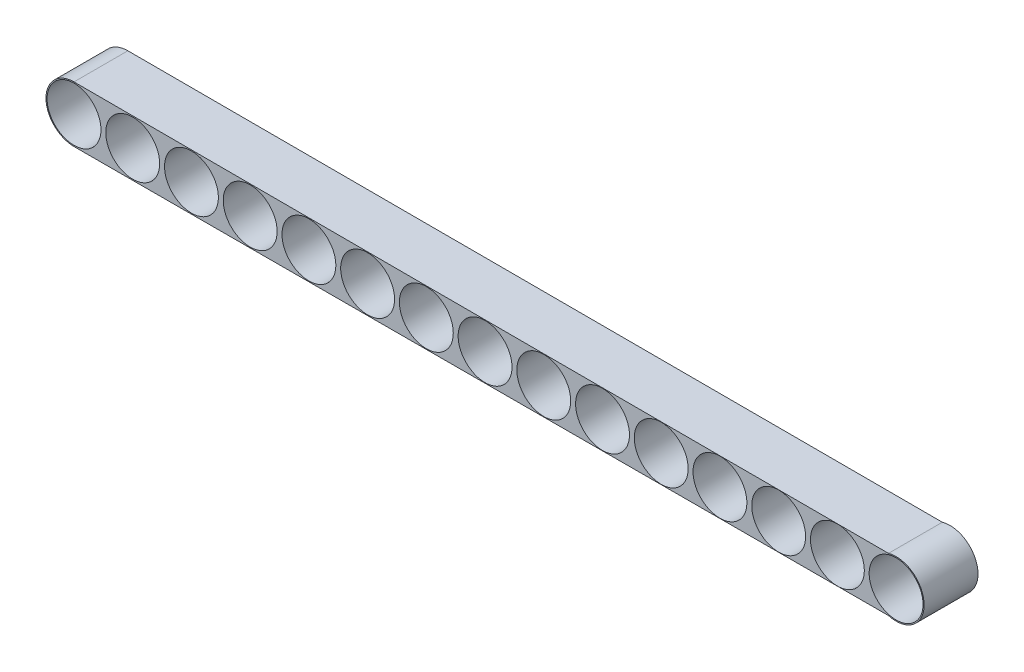
ISO-10303-21;
HEADER;
FILE_DESCRIPTION(('STEP AP214'),'2;1');
FILE_NAME('part.step','',(''),(''),'','','');
FILE_SCHEMA(('AUTOMOTIVE_DESIGN { 1 0 10303 214 1 1 1 1 }'));
ENDSEC;
DATA;
#1=APPLICATION_CONTEXT('core data for automotive mechanical design processes');
#2=APPLICATION_PROTOCOL_DEFINITION('international standard','automotive_design',2000,#1);
#3=PRODUCT_CONTEXT('',#1,'mechanical');
#4=PRODUCT('Part','Part','',(#3));
#5=PRODUCT_RELATED_PRODUCT_CATEGORY('part','',(#4));
#6=PRODUCT_DEFINITION_FORMATION('','',#4);
#7=PRODUCT_DEFINITION_CONTEXT('part definition',#1,'design');
#8=PRODUCT_DEFINITION('design','',#6,#7);
#9=PRODUCT_DEFINITION_SHAPE('','',#8);
#10=(LENGTH_UNIT() NAMED_UNIT(*) SI_UNIT(.MILLI.,.METRE.));
#11=(NAMED_UNIT(*) PLANE_ANGLE_UNIT() SI_UNIT($,.RADIAN.));
#12=(NAMED_UNIT(*) SI_UNIT($,.STERADIAN.) SOLID_ANGLE_UNIT());
#13=UNCERTAINTY_MEASURE_WITH_UNIT(LENGTH_MEASURE(1.E-05),#10,'distance_accuracy_value','');
#14=(GEOMETRIC_REPRESENTATION_CONTEXT(3) GLOBAL_UNCERTAINTY_ASSIGNED_CONTEXT((#13)) GLOBAL_UNIT_ASSIGNED_CONTEXT((#10,
#11,#12)) REPRESENTATION_CONTEXT('',''));
#15=CARTESIAN_POINT('',(0.,0.,0.));
#16=DIRECTION('',(0.,0.,1.));
#17=DIRECTION('',(1.,0.,0.));
#18=AXIS2_PLACEMENT_3D('',#15,#16,#17);
#19=CARTESIAN_POINT('',(0.000681519143892638,-0.519999106790113,1.));
#20=DIRECTION('',(-0.00131061486388455,0.999999141143971,0.));
#21=DIRECTION('',(-0.999999141143971,-0.00131061486388455,0.));
#22=AXIS2_PLACEMENT_3D('',#19,#20,#21);
#23=PLANE('',#22);
#24=DIRECTION('',(0.99999914114397,0.00131061486388455,0.));
#25=VECTOR('',#24,1.);
#26=CARTESIAN_POINT('',(0.000681519143892638,-0.519999106790113,0.));
#27=LINE('',#26,#25);
#28=CARTESIAN_POINT('',(0.,-0.52,0.));
#29=VERTEX_POINT('',#28);
#30=CARTESIAN_POINT('',(15.1178253576786,-0.500186336359531,0.));
#31=VERTEX_POINT('',#30);
#32=EDGE_CURVE('E144',#29,#31,#27,.T.);
#33=ORIENTED_EDGE('',*,*,#32,.T.);
#34=DIRECTION('',(0.,0.,-1.));
#35=VECTOR('',#34,1.);
#36=CARTESIAN_POINT('',(15.1178253576786,-0.500186336359531,1.));
#37=LINE('',#36,#35);
#38=CARTESIAN_POINT('',(15.1178253576786,-0.500186336359531,1.));
#39=VERTEX_POINT('',#38);
#40=EDGE_CURVE('E11',#39,#31,#37,.T.);
#41=ORIENTED_EDGE('',*,*,#40,.F.);
#42=DIRECTION('',(0.99999914114397,0.00131061486388455,0.));
#43=VECTOR('',#42,1.);
#44=CARTESIAN_POINT('',(0.000681519143892638,-0.519999106790113,1.));
#45=LINE('',#44,#43);
#46=CARTESIAN_POINT('',(0.,-0.52,1.));
#47=VERTEX_POINT('',#46);
#48=EDGE_CURVE('E84',#47,#39,#45,.T.);
#49=ORIENTED_EDGE('',*,*,#48,.F.);
#50=DIRECTION('',(0.,0.,-1.));
#51=VECTOR('',#50,1.);
#52=CARTESIAN_POINT('',(0.,-0.52,1.));
#53=LINE('',#52,#51);
#54=EDGE_CURVE('E140',#47,#29,#53,.T.);
#55=ORIENTED_EDGE('',*,*,#54,.T.);
#56=EDGE_LOOP('',(#33,#41,#49,#55));
#57=FACE_BOUND('',#56,.T.);
#58=ADVANCED_FACE('F35',(#57),#23,.F.);
#59=CARTESIAN_POINT('',(15.26,0.,1.));
#60=DIRECTION('',(0.,0.,-1.));
#61=DIRECTION('',(-1.,0.,0.));
#62=AXIS2_PLACEMENT_3D('',#59,#60,#61);
#63=CYLINDRICAL_SURFACE('',#62,0.520000000000001);
#64=CARTESIAN_POINT('',(15.26,0.,0.));
#65=DIRECTION('',(0.,0.,1.));
#66=DIRECTION('',(1.,0.,0.));
#67=AXIS2_PLACEMENT_3D('',#64,#65,#66);
#68=CIRCLE('',#67,0.520000000000001);
#69=CARTESIAN_POINT('',(15.1178253576786,0.500186336359531,0.));
#70=VERTEX_POINT('',#69);
#71=EDGE_CURVE('E89',#31,#70,#68,.T.);
#72=ORIENTED_EDGE('',*,*,#71,.T.);
#73=DIRECTION('',(0.,0.,-1.));
#74=VECTOR('',#73,1.);
#75=CARTESIAN_POINT('',(15.1178253576786,0.500186336359531,1.));
#76=LINE('',#75,#74);
#77=CARTESIAN_POINT('',(15.1178253576786,0.500186336359531,1.));
#78=VERTEX_POINT('',#77);
#79=EDGE_CURVE('E44',#78,#70,#76,.T.);
#80=ORIENTED_EDGE('',*,*,#79,.F.);
#81=CARTESIAN_POINT('',(15.26,0.,1.));
#82=DIRECTION('',(0.,0.,1.));
#83=DIRECTION('',(1.,0.,0.));
#84=AXIS2_PLACEMENT_3D('',#81,#82,#83);
#85=CIRCLE('',#84,0.520000000000001);
#86=EDGE_CURVE('E78',#39,#78,#85,.T.);
#87=ORIENTED_EDGE('',*,*,#86,.F.);
#88=ORIENTED_EDGE('',*,*,#40,.T.);
#89=EDGE_LOOP('',(#72,#80,#87,#88));
#90=FACE_BOUND('',#89,.T.);
#91=ADVANCED_FACE('F88',(#90),#63,.T.);
#92=CARTESIAN_POINT('',(0.000681519143892638,0.519999106790113,1.));
#93=DIRECTION('',(0.00131061486388455,0.999999141143971,0.));
#94=DIRECTION('',(-0.999999141143971,0.00131061486388455,0.));
#95=AXIS2_PLACEMENT_3D('',#92,#93,#94);
#96=PLANE('',#95);
#97=DIRECTION('',(0.99999914114397,-0.00131061486388455,0.));
#98=VECTOR('',#97,1.);
#99=CARTESIAN_POINT('',(0.000681519143892638,0.519999106790113,0.));
#100=LINE('',#99,#98);
#101=CARTESIAN_POINT('',(0.,0.52,0.));
#102=VERTEX_POINT('',#101);
#103=EDGE_CURVE('E148',#102,#70,#100,.T.);
#104=ORIENTED_EDGE('',*,*,#103,.F.);
#105=DIRECTION('',(0.,0.,-1.));
#106=VECTOR('',#105,1.);
#107=CARTESIAN_POINT('',(0.,0.52,1.));
#108=LINE('',#107,#106);
#109=CARTESIAN_POINT('',(0.,0.52,1.));
#110=VERTEX_POINT('',#109);
#111=EDGE_CURVE('E68',#110,#102,#108,.T.);
#112=ORIENTED_EDGE('',*,*,#111,.F.);
#113=DIRECTION('',(0.99999914114397,-0.00131061486388455,0.));
#114=VECTOR('',#113,1.);
#115=CARTESIAN_POINT('',(0.000681519143892638,0.519999106790113,1.));
#116=LINE('',#115,#114);
#117=EDGE_CURVE('E82',#110,#78,#116,.T.);
#118=ORIENTED_EDGE('',*,*,#117,.T.);
#119=ORIENTED_EDGE('',*,*,#79,.T.);
#120=EDGE_LOOP('',(#104,#112,#118,#119));
#121=FACE_BOUND('',#120,.T.);
#122=ADVANCED_FACE('F93',(#121),#96,.T.);
#123=CARTESIAN_POINT('',(1.09,0.,1.));
#124=DIRECTION('',(0.,0.,-1.));
#125=DIRECTION('',(-1.,0.,0.));
#126=AXIS2_PLACEMENT_3D('',#123,#124,#125);
#127=CYLINDRICAL_SURFACE('',#126,0.5);
#128=CARTESIAN_POINT('',(1.09,0.,1.));
#129=DIRECTION('',(0.,0.,1.));
#130=DIRECTION('',(1.,0.,0.));
#131=AXIS2_PLACEMENT_3D('',#128,#129,#130);
#132=CIRCLE('',#131,0.5);
#133=CARTESIAN_POINT('',(1.59,0.,1.));
#134=VERTEX_POINT('',#133);
#135=EDGE_CURVE('E134',#134,#134,#132,.T.);
#136=ORIENTED_EDGE('',*,*,#135,.T.);
#137=EDGE_LOOP('',(#136));
#138=FACE_BOUND('',#137,.T.);
#139=CARTESIAN_POINT('',(1.09,0.,0.));
#140=DIRECTION('',(0.,0.,1.));
#141=DIRECTION('',(1.,0.,0.));
#142=AXIS2_PLACEMENT_3D('',#139,#140,#141);
#143=CIRCLE('',#142,0.5);
#144=CARTESIAN_POINT('',(1.59,0.,0.));
#145=VERTEX_POINT('',#144);
#146=EDGE_CURVE('E187',#145,#145,#143,.T.);
#147=ORIENTED_EDGE('',*,*,#146,.F.);
#148=EDGE_LOOP('',(#147));
#149=FACE_BOUND('',#148,.T.);
#150=ADVANCED_FACE('F252',(#138,#149),#127,.F.);
#151=CARTESIAN_POINT('',(2.18,0.,1.));
#152=DIRECTION('',(0.,0.,-1.));
#153=DIRECTION('',(-1.,0.,0.));
#154=AXIS2_PLACEMENT_3D('',#151,#152,#153);
#155=CYLINDRICAL_SURFACE('',#154,0.5);
#156=CARTESIAN_POINT('',(2.18,0.,1.));
#157=DIRECTION('',(0.,0.,1.));
#158=DIRECTION('',(1.,0.,0.));
#159=AXIS2_PLACEMENT_3D('',#156,#157,#158);
#160=CIRCLE('',#159,0.5);
#161=CARTESIAN_POINT('',(2.68,0.,1.));
#162=VERTEX_POINT('',#161);
#163=EDGE_CURVE('E131',#162,#162,#160,.T.);
#164=ORIENTED_EDGE('',*,*,#163,.T.);
#165=EDGE_LOOP('',(#164));
#166=FACE_BOUND('',#165,.T.);
#167=CARTESIAN_POINT('',(2.18,0.,0.));
#168=DIRECTION('',(0.,0.,1.));
#169=DIRECTION('',(1.,0.,0.));
#170=AXIS2_PLACEMENT_3D('',#167,#168,#169);
#171=CIRCLE('',#170,0.5);
#172=CARTESIAN_POINT('',(2.68,0.,0.));
#173=VERTEX_POINT('',#172);
#174=EDGE_CURVE('E184',#173,#173,#171,.T.);
#175=ORIENTED_EDGE('',*,*,#174,.F.);
#176=EDGE_LOOP('',(#175));
#177=FACE_BOUND('',#176,.T.);
#178=ADVANCED_FACE('F298',(#166,#177),#155,.F.);
#179=CARTESIAN_POINT('',(3.27,0.,1.));
#180=DIRECTION('',(0.,0.,-1.));
#181=DIRECTION('',(-1.,0.,0.));
#182=AXIS2_PLACEMENT_3D('',#179,#180,#181);
#183=CYLINDRICAL_SURFACE('',#182,0.5);
#184=CARTESIAN_POINT('',(3.27,0.,1.));
#185=DIRECTION('',(0.,0.,1.));
#186=DIRECTION('',(1.,0.,0.));
#187=AXIS2_PLACEMENT_3D('',#184,#185,#186);
#188=CIRCLE('',#187,0.5);
#189=CARTESIAN_POINT('',(3.77,0.,1.));
#190=VERTEX_POINT('',#189);
#191=EDGE_CURVE('E128',#190,#190,#188,.T.);
#192=ORIENTED_EDGE('',*,*,#191,.T.);
#193=EDGE_LOOP('',(#192));
#194=FACE_BOUND('',#193,.T.);
#195=CARTESIAN_POINT('',(3.27,0.,0.));
#196=DIRECTION('',(0.,0.,1.));
#197=DIRECTION('',(1.,0.,0.));
#198=AXIS2_PLACEMENT_3D('',#195,#196,#197);
#199=CIRCLE('',#198,0.5);
#200=CARTESIAN_POINT('',(3.77,0.,0.));
#201=VERTEX_POINT('',#200);
#202=EDGE_CURVE('E181',#201,#201,#199,.T.);
#203=ORIENTED_EDGE('',*,*,#202,.F.);
#204=EDGE_LOOP('',(#203));
#205=FACE_BOUND('',#204,.T.);
#206=ADVANCED_FACE('F294',(#194,#205),#183,.F.);
#207=CARTESIAN_POINT('',(4.36,0.,1.));
#208=DIRECTION('',(0.,0.,-1.));
#209=DIRECTION('',(-1.,0.,0.));
#210=AXIS2_PLACEMENT_3D('',#207,#208,#209);
#211=CYLINDRICAL_SURFACE('',#210,0.5);
#212=CARTESIAN_POINT('',(4.36,0.,1.));
#213=DIRECTION('',(0.,0.,1.));
#214=DIRECTION('',(1.,0.,0.));
#215=AXIS2_PLACEMENT_3D('',#212,#213,#214);
#216=CIRCLE('',#215,0.5);
#217=CARTESIAN_POINT('',(4.86,0.,1.));
#218=VERTEX_POINT('',#217);
#219=EDGE_CURVE('E125',#218,#218,#216,.T.);
#220=ORIENTED_EDGE('',*,*,#219,.T.);
#221=EDGE_LOOP('',(#220));
#222=FACE_BOUND('',#221,.T.);
#223=CARTESIAN_POINT('',(4.36,0.,0.));
#224=DIRECTION('',(0.,0.,1.));
#225=DIRECTION('',(1.,0.,0.));
#226=AXIS2_PLACEMENT_3D('',#223,#224,#225);
#227=CIRCLE('',#226,0.5);
#228=CARTESIAN_POINT('',(4.86,0.,0.));
#229=VERTEX_POINT('',#228);
#230=EDGE_CURVE('E178',#229,#229,#227,.T.);
#231=ORIENTED_EDGE('',*,*,#230,.F.);
#232=EDGE_LOOP('',(#231));
#233=FACE_BOUND('',#232,.T.);
#234=ADVANCED_FACE('F290',(#222,#233),#211,.F.);
#235=CARTESIAN_POINT('',(5.45,0.,1.));
#236=DIRECTION('',(0.,0.,-1.));
#237=DIRECTION('',(-1.,0.,0.));
#238=AXIS2_PLACEMENT_3D('',#235,#236,#237);
#239=CYLINDRICAL_SURFACE('',#238,0.5);
#240=CARTESIAN_POINT('',(5.45,0.,1.));
#241=DIRECTION('',(0.,0.,1.));
#242=DIRECTION('',(1.,0.,0.));
#243=AXIS2_PLACEMENT_3D('',#240,#241,#242);
#244=CIRCLE('',#243,0.5);
#245=CARTESIAN_POINT('',(5.95,0.,1.));
#246=VERTEX_POINT('',#245);
#247=EDGE_CURVE('E122',#246,#246,#244,.T.);
#248=ORIENTED_EDGE('',*,*,#247,.T.);
#249=EDGE_LOOP('',(#248));
#250=FACE_BOUND('',#249,.T.);
#251=CARTESIAN_POINT('',(5.45,0.,0.));
#252=DIRECTION('',(0.,0.,1.));
#253=DIRECTION('',(1.,0.,0.));
#254=AXIS2_PLACEMENT_3D('',#251,#252,#253);
#255=CIRCLE('',#254,0.5);
#256=CARTESIAN_POINT('',(5.95,0.,0.));
#257=VERTEX_POINT('',#256);
#258=EDGE_CURVE('E175',#257,#257,#255,.T.);
#259=ORIENTED_EDGE('',*,*,#258,.F.);
#260=EDGE_LOOP('',(#259));
#261=FACE_BOUND('',#260,.T.);
#262=ADVANCED_FACE('F286',(#250,#261),#239,.F.);
#263=CARTESIAN_POINT('',(6.54,0.,1.));
#264=DIRECTION('',(0.,0.,-1.));
#265=DIRECTION('',(-1.,0.,0.));
#266=AXIS2_PLACEMENT_3D('',#263,#264,#265);
#267=CYLINDRICAL_SURFACE('',#266,0.5);
#268=CARTESIAN_POINT('',(6.54,0.,1.));
#269=DIRECTION('',(0.,0.,1.));
#270=DIRECTION('',(1.,0.,0.));
#271=AXIS2_PLACEMENT_3D('',#268,#269,#270);
#272=CIRCLE('',#271,0.5);
#273=CARTESIAN_POINT('',(7.04,0.,1.));
#274=VERTEX_POINT('',#273);
#275=EDGE_CURVE('E119',#274,#274,#272,.T.);
#276=ORIENTED_EDGE('',*,*,#275,.T.);
#277=EDGE_LOOP('',(#276));
#278=FACE_BOUND('',#277,.T.);
#279=CARTESIAN_POINT('',(6.54,0.,0.));
#280=DIRECTION('',(0.,0.,1.));
#281=DIRECTION('',(1.,0.,0.));
#282=AXIS2_PLACEMENT_3D('',#279,#280,#281);
#283=CIRCLE('',#282,0.5);
#284=CARTESIAN_POINT('',(7.04,0.,0.));
#285=VERTEX_POINT('',#284);
#286=EDGE_CURVE('E172',#285,#285,#283,.T.);
#287=ORIENTED_EDGE('',*,*,#286,.F.);
#288=EDGE_LOOP('',(#287));
#289=FACE_BOUND('',#288,.T.);
#290=ADVANCED_FACE('F282',(#278,#289),#267,.F.);
#291=CARTESIAN_POINT('',(7.63,0.,1.));
#292=DIRECTION('',(0.,0.,-1.));
#293=DIRECTION('',(-1.,0.,0.));
#294=AXIS2_PLACEMENT_3D('',#291,#292,#293);
#295=CYLINDRICAL_SURFACE('',#294,0.5);
#296=CARTESIAN_POINT('',(7.63,0.,1.));
#297=DIRECTION('',(0.,0.,1.));
#298=DIRECTION('',(1.,0.,0.));
#299=AXIS2_PLACEMENT_3D('',#296,#297,#298);
#300=CIRCLE('',#299,0.5);
#301=CARTESIAN_POINT('',(8.13,0.,1.));
#302=VERTEX_POINT('',#301);
#303=EDGE_CURVE('E116',#302,#302,#300,.T.);
#304=ORIENTED_EDGE('',*,*,#303,.T.);
#305=EDGE_LOOP('',(#304));
#306=FACE_BOUND('',#305,.T.);
#307=CARTESIAN_POINT('',(7.63,0.,0.));
#308=DIRECTION('',(0.,0.,1.));
#309=DIRECTION('',(1.,0.,0.));
#310=AXIS2_PLACEMENT_3D('',#307,#308,#309);
#311=CIRCLE('',#310,0.5);
#312=CARTESIAN_POINT('',(8.13,0.,0.));
#313=VERTEX_POINT('',#312);
#314=EDGE_CURVE('E169',#313,#313,#311,.T.);
#315=ORIENTED_EDGE('',*,*,#314,.F.);
#316=EDGE_LOOP('',(#315));
#317=FACE_BOUND('',#316,.T.);
#318=ADVANCED_FACE('F278',(#306,#317),#295,.F.);
#319=CARTESIAN_POINT('',(8.72,0.,1.));
#320=DIRECTION('',(0.,0.,-1.));
#321=DIRECTION('',(-1.,0.,0.));
#322=AXIS2_PLACEMENT_3D('',#319,#320,#321);
#323=CYLINDRICAL_SURFACE('',#322,0.500000000000001);
#324=CARTESIAN_POINT('',(8.72,0.,1.));
#325=DIRECTION('',(0.,0.,1.));
#326=DIRECTION('',(1.,0.,0.));
#327=AXIS2_PLACEMENT_3D('',#324,#325,#326);
#328=CIRCLE('',#327,0.500000000000001);
#329=CARTESIAN_POINT('',(9.22,0.,1.));
#330=VERTEX_POINT('',#329);
#331=EDGE_CURVE('E113',#330,#330,#328,.T.);
#332=ORIENTED_EDGE('',*,*,#331,.T.);
#333=EDGE_LOOP('',(#332));
#334=FACE_BOUND('',#333,.T.);
#335=CARTESIAN_POINT('',(8.72,0.,0.));
#336=DIRECTION('',(0.,0.,1.));
#337=DIRECTION('',(1.,0.,0.));
#338=AXIS2_PLACEMENT_3D('',#335,#336,#337);
#339=CIRCLE('',#338,0.500000000000001);
#340=CARTESIAN_POINT('',(9.22,0.,0.));
#341=VERTEX_POINT('',#340);
#342=EDGE_CURVE('E166',#341,#341,#339,.T.);
#343=ORIENTED_EDGE('',*,*,#342,.F.);
#344=EDGE_LOOP('',(#343));
#345=FACE_BOUND('',#344,.T.);
#346=ADVANCED_FACE('F274',(#334,#345),#323,.F.);
#347=CARTESIAN_POINT('',(9.81,0.,1.));
#348=DIRECTION('',(0.,0.,-1.));
#349=DIRECTION('',(-1.,0.,0.));
#350=AXIS2_PLACEMENT_3D('',#347,#348,#349);
#351=CYLINDRICAL_SURFACE('',#350,0.500000000000001);
#352=CARTESIAN_POINT('',(9.81,0.,1.));
#353=DIRECTION('',(0.,0.,1.));
#354=DIRECTION('',(1.,0.,0.));
#355=AXIS2_PLACEMENT_3D('',#352,#353,#354);
#356=CIRCLE('',#355,0.500000000000001);
#357=CARTESIAN_POINT('',(10.31,0.,1.));
#358=VERTEX_POINT('',#357);
#359=EDGE_CURVE('E110',#358,#358,#356,.T.);
#360=ORIENTED_EDGE('',*,*,#359,.T.);
#361=EDGE_LOOP('',(#360));
#362=FACE_BOUND('',#361,.T.);
#363=CARTESIAN_POINT('',(9.81,0.,0.));
#364=DIRECTION('',(0.,0.,1.));
#365=DIRECTION('',(1.,0.,0.));
#366=AXIS2_PLACEMENT_3D('',#363,#364,#365);
#367=CIRCLE('',#366,0.500000000000001);
#368=CARTESIAN_POINT('',(10.31,0.,0.));
#369=VERTEX_POINT('',#368);
#370=EDGE_CURVE('E163',#369,#369,#367,.T.);
#371=ORIENTED_EDGE('',*,*,#370,.F.);
#372=EDGE_LOOP('',(#371));
#373=FACE_BOUND('',#372,.T.);
#374=ADVANCED_FACE('F270',(#362,#373),#351,.F.);
#375=CARTESIAN_POINT('',(14.17,0.,1.));
#376=DIRECTION('',(0.,0.,-1.));
#377=DIRECTION('',(-1.,0.,0.));
#378=AXIS2_PLACEMENT_3D('',#375,#376,#377);
#379=CYLINDRICAL_SURFACE('',#378,0.500000000000001);
#380=CARTESIAN_POINT('',(14.17,0.,1.));
#381=DIRECTION('',(0.,0.,1.));
#382=DIRECTION('',(1.,0.,0.));
#383=AXIS2_PLACEMENT_3D('',#380,#381,#382);
#384=CIRCLE('',#383,0.500000000000001);
#385=CARTESIAN_POINT('',(14.67,0.,1.));
#386=VERTEX_POINT('',#385);
#387=EDGE_CURVE('E107',#386,#386,#384,.T.);
#388=ORIENTED_EDGE('',*,*,#387,.T.);
#389=EDGE_LOOP('',(#388));
#390=FACE_BOUND('',#389,.T.);
#391=CARTESIAN_POINT('',(14.17,0.,0.));
#392=DIRECTION('',(0.,0.,1.));
#393=DIRECTION('',(1.,0.,0.));
#394=AXIS2_PLACEMENT_3D('',#391,#392,#393);
#395=CIRCLE('',#394,0.500000000000001);
#396=CARTESIAN_POINT('',(14.67,0.,0.));
#397=VERTEX_POINT('',#396);
#398=EDGE_CURVE('E160',#397,#397,#395,.T.);
#399=ORIENTED_EDGE('',*,*,#398,.F.);
#400=EDGE_LOOP('',(#399));
#401=FACE_BOUND('',#400,.T.);
#402=ADVANCED_FACE('F266',(#390,#401),#379,.F.);
#403=CARTESIAN_POINT('',(10.9,0.,1.));
#404=DIRECTION('',(0.,0.,-1.));
#405=DIRECTION('',(-1.,0.,0.));
#406=AXIS2_PLACEMENT_3D('',#403,#404,#405);
#407=CYLINDRICAL_SURFACE('',#406,0.500000000000001);
#408=CARTESIAN_POINT('',(10.9,0.,1.));
#409=DIRECTION('',(0.,0.,1.));
#410=DIRECTION('',(1.,0.,0.));
#411=AXIS2_PLACEMENT_3D('',#408,#409,#410);
#412=CIRCLE('',#411,0.500000000000001);
#413=CARTESIAN_POINT('',(11.4,0.,1.));
#414=VERTEX_POINT('',#413);
#415=EDGE_CURVE('E104',#414,#414,#412,.T.);
#416=ORIENTED_EDGE('',*,*,#415,.T.);
#417=EDGE_LOOP('',(#416));
#418=FACE_BOUND('',#417,.T.);
#419=CARTESIAN_POINT('',(10.9,0.,0.));
#420=DIRECTION('',(0.,0.,1.));
#421=DIRECTION('',(1.,0.,0.));
#422=AXIS2_PLACEMENT_3D('',#419,#420,#421);
#423=CIRCLE('',#422,0.500000000000001);
#424=CARTESIAN_POINT('',(11.4,0.,0.));
#425=VERTEX_POINT('',#424);
#426=EDGE_CURVE('E157',#425,#425,#423,.T.);
#427=ORIENTED_EDGE('',*,*,#426,.F.);
#428=EDGE_LOOP('',(#427));
#429=FACE_BOUND('',#428,.T.);
#430=ADVANCED_FACE('F262',(#418,#429),#407,.F.);
#431=CARTESIAN_POINT('',(13.08,0.,1.));
#432=DIRECTION('',(0.,0.,-1.));
#433=DIRECTION('',(-1.,0.,0.));
#434=AXIS2_PLACEMENT_3D('',#431,#432,#433);
#435=CYLINDRICAL_SURFACE('',#434,0.500000000000001);
#436=CARTESIAN_POINT('',(13.08,0.,1.));
#437=DIRECTION('',(0.,0.,1.));
#438=DIRECTION('',(1.,0.,0.));
#439=AXIS2_PLACEMENT_3D('',#436,#437,#438);
#440=CIRCLE('',#439,0.500000000000001);
#441=CARTESIAN_POINT('',(13.58,0.,1.));
#442=VERTEX_POINT('',#441);
#443=EDGE_CURVE('E101',#442,#442,#440,.T.);
#444=ORIENTED_EDGE('',*,*,#443,.T.);
#445=EDGE_LOOP('',(#444));
#446=FACE_BOUND('',#445,.T.);
#447=CARTESIAN_POINT('',(13.08,0.,0.));
#448=DIRECTION('',(0.,0.,1.));
#449=DIRECTION('',(1.,0.,0.));
#450=AXIS2_PLACEMENT_3D('',#447,#448,#449);
#451=CIRCLE('',#450,0.500000000000001);
#452=CARTESIAN_POINT('',(13.58,0.,0.));
#453=VERTEX_POINT('',#452);
#454=EDGE_CURVE('E154',#453,#453,#451,.T.);
#455=ORIENTED_EDGE('',*,*,#454,.F.);
#456=EDGE_LOOP('',(#455));
#457=FACE_BOUND('',#456,.T.);
#458=ADVANCED_FACE('F258',(#446,#457),#435,.F.);
#459=CARTESIAN_POINT('',(11.99,0.,1.));
#460=DIRECTION('',(0.,0.,-1.));
#461=DIRECTION('',(-1.,0.,0.));
#462=AXIS2_PLACEMENT_3D('',#459,#460,#461);
#463=CYLINDRICAL_SURFACE('',#462,0.500000000000001);
#464=CARTESIAN_POINT('',(11.99,0.,1.));
#465=DIRECTION('',(0.,0.,1.));
#466=DIRECTION('',(1.,0.,0.));
#467=AXIS2_PLACEMENT_3D('',#464,#465,#466);
#468=CIRCLE('',#467,0.500000000000001);
#469=CARTESIAN_POINT('',(12.49,0.,1.));
#470=VERTEX_POINT('',#469);
#471=EDGE_CURVE('E95',#470,#470,#468,.T.);
#472=ORIENTED_EDGE('',*,*,#471,.T.);
#473=EDGE_LOOP('',(#472));
#474=FACE_BOUND('',#473,.T.);
#475=CARTESIAN_POINT('',(11.99,0.,0.));
#476=DIRECTION('',(0.,0.,1.));
#477=DIRECTION('',(1.,0.,0.));
#478=AXIS2_PLACEMENT_3D('',#475,#476,#477);
#479=CIRCLE('',#478,0.500000000000001);
#480=CARTESIAN_POINT('',(12.49,0.,0.));
#481=VERTEX_POINT('',#480);
#482=EDGE_CURVE('E151',#481,#481,#479,.T.);
#483=ORIENTED_EDGE('',*,*,#482,.F.);
#484=EDGE_LOOP('',(#483));
#485=FACE_BOUND('',#484,.T.);
#486=ADVANCED_FACE('F255',(#474,#485),#463,.F.);
#487=CARTESIAN_POINT('',(0.,0.,1.));
#488=DIRECTION('',(0.,0.,-1.));
#489=DIRECTION('',(-1.,0.,0.));
#490=AXIS2_PLACEMENT_3D('',#487,#488,#489);
#491=CYLINDRICAL_SURFACE('',#490,0.52);
#492=CARTESIAN_POINT('',(0.,0.,0.));
#493=DIRECTION('',(0.,0.,1.));
#494=DIRECTION('',(1.,0.,0.));
#495=AXIS2_PLACEMENT_3D('',#492,#493,#494);
#496=CIRCLE('',#495,0.52);
#497=EDGE_CURVE('E71',#102,#29,#496,.T.);
#498=ORIENTED_EDGE('',*,*,#497,.T.);
#499=ORIENTED_EDGE('',*,*,#54,.F.);
#500=CARTESIAN_POINT('',(0.,0.,1.));
#501=DIRECTION('',(0.,0.,1.));
#502=DIRECTION('',(1.,0.,0.));
#503=AXIS2_PLACEMENT_3D('',#500,#501,#502);
#504=CIRCLE('',#503,0.52);
#505=EDGE_CURVE('E52',#110,#47,#504,.T.);
#506=ORIENTED_EDGE('',*,*,#505,.F.);
#507=ORIENTED_EDGE('',*,*,#111,.T.);
#508=EDGE_LOOP('',(#498,#499,#506,#507));
#509=FACE_BOUND('',#508,.T.);
#510=ADVANCED_FACE('F241',(#509),#491,.T.);
#511=CARTESIAN_POINT('',(15.26,0.,1.));
#512=DIRECTION('',(0.,0.,-1.));
#513=DIRECTION('',(-1.,0.,0.));
#514=AXIS2_PLACEMENT_3D('',#511,#512,#513);
#515=CYLINDRICAL_SURFACE('',#514,0.500000000000001);
#516=CARTESIAN_POINT('',(15.26,0.,1.));
#517=DIRECTION('',(0.,0.,1.));
#518=DIRECTION('',(1.,0.,0.));
#519=AXIS2_PLACEMENT_3D('',#516,#517,#518);
#520=CIRCLE('',#519,0.500000000000001);
#521=CARTESIAN_POINT('',(15.76,0.,1.));
#522=VERTEX_POINT('',#521);
#523=EDGE_CURVE('E193',#522,#522,#520,.T.);
#524=ORIENTED_EDGE('',*,*,#523,.T.);
#525=EDGE_LOOP('',(#524));
#526=FACE_BOUND('',#525,.T.);
#527=CARTESIAN_POINT('',(15.26,0.,0.));
#528=DIRECTION('',(0.,0.,1.));
#529=DIRECTION('',(1.,0.,0.));
#530=AXIS2_PLACEMENT_3D('',#527,#528,#529);
#531=CIRCLE('',#530,0.500000000000001);
#532=CARTESIAN_POINT('',(15.76,0.,0.));
#533=VERTEX_POINT('',#532);
#534=EDGE_CURVE('E141',#533,#533,#531,.T.);
#535=ORIENTED_EDGE('',*,*,#534,.F.);
#536=EDGE_LOOP('',(#535));
#537=FACE_BOUND('',#536,.T.);
#538=ADVANCED_FACE('F37',(#526,#537),#515,.F.);
#539=CARTESIAN_POINT('',(0.,0.,1.));
#540=DIRECTION('',(0.,0.,-1.));
#541=DIRECTION('',(-1.,0.,0.));
#542=AXIS2_PLACEMENT_3D('',#539,#540,#541);
#543=CYLINDRICAL_SURFACE('',#542,0.5);
#544=CARTESIAN_POINT('',(0.,0.,1.));
#545=DIRECTION('',(0.,0.,1.));
#546=DIRECTION('',(1.,0.,0.));
#547=AXIS2_PLACEMENT_3D('',#544,#545,#546);
#548=CIRCLE('',#547,0.5);
#549=CARTESIAN_POINT('',(0.5,0.,1.));
#550=VERTEX_POINT('',#549);
#551=EDGE_CURVE('E137',#550,#550,#548,.T.);
#552=ORIENTED_EDGE('',*,*,#551,.T.);
#553=EDGE_LOOP('',(#552));
#554=FACE_BOUND('',#553,.T.);
#555=CARTESIAN_POINT('',(0.,0.,0.));
#556=DIRECTION('',(0.,0.,1.));
#557=DIRECTION('',(1.,0.,0.));
#558=AXIS2_PLACEMENT_3D('',#555,#556,#557);
#559=CIRCLE('',#558,0.5);
#560=CARTESIAN_POINT('',(0.5,0.,0.));
#561=VERTEX_POINT('',#560);
#562=EDGE_CURVE('E190',#561,#561,#559,.T.);
#563=ORIENTED_EDGE('',*,*,#562,.F.);
#564=EDGE_LOOP('',(#563));
#565=FACE_BOUND('',#564,.T.);
#566=ADVANCED_FACE('F231',(#554,#565),#543,.F.);
#567=CARTESIAN_POINT('',(0.,0.,1.));
#568=DIRECTION('',(0.,0.,1.));
#569=DIRECTION('',(1.,0.,0.));
#570=AXIS2_PLACEMENT_3D('',#567,#568,#569);
#571=PLANE('',#570);
#572=ORIENTED_EDGE('',*,*,#523,.F.);
#573=EDGE_LOOP('',(#572));
#574=FACE_BOUND('',#573,.T.);
#575=ORIENTED_EDGE('',*,*,#48,.T.);
#576=ORIENTED_EDGE('',*,*,#86,.T.);
#577=ORIENTED_EDGE('',*,*,#117,.F.);
#578=ORIENTED_EDGE('',*,*,#505,.T.);
#579=EDGE_LOOP('',(#575,#576,#577,#578));
#580=FACE_BOUND('',#579,.T.);
#581=ORIENTED_EDGE('',*,*,#471,.F.);
#582=EDGE_LOOP('',(#581));
#583=FACE_BOUND('',#582,.T.);
#584=ORIENTED_EDGE('',*,*,#443,.F.);
#585=EDGE_LOOP('',(#584));
#586=FACE_BOUND('',#585,.T.);
#587=ORIENTED_EDGE('',*,*,#415,.F.);
#588=EDGE_LOOP('',(#587));
#589=FACE_BOUND('',#588,.T.);
#590=ORIENTED_EDGE('',*,*,#387,.F.);
#591=EDGE_LOOP('',(#590));
#592=FACE_BOUND('',#591,.T.);
#593=ORIENTED_EDGE('',*,*,#359,.F.);
#594=EDGE_LOOP('',(#593));
#595=FACE_BOUND('',#594,.T.);
#596=ORIENTED_EDGE('',*,*,#331,.F.);
#597=EDGE_LOOP('',(#596));
#598=FACE_BOUND('',#597,.T.);
#599=ORIENTED_EDGE('',*,*,#303,.F.);
#600=EDGE_LOOP('',(#599));
#601=FACE_BOUND('',#600,.T.);
#602=ORIENTED_EDGE('',*,*,#275,.F.);
#603=EDGE_LOOP('',(#602));
#604=FACE_BOUND('',#603,.T.);
#605=ORIENTED_EDGE('',*,*,#247,.F.);
#606=EDGE_LOOP('',(#605));
#607=FACE_BOUND('',#606,.T.);
#608=ORIENTED_EDGE('',*,*,#219,.F.);
#609=EDGE_LOOP('',(#608));
#610=FACE_BOUND('',#609,.T.);
#611=ORIENTED_EDGE('',*,*,#191,.F.);
#612=EDGE_LOOP('',(#611));
#613=FACE_BOUND('',#612,.T.);
#614=ORIENTED_EDGE('',*,*,#163,.F.);
#615=EDGE_LOOP('',(#614));
#616=FACE_BOUND('',#615,.T.);
#617=ORIENTED_EDGE('',*,*,#135,.F.);
#618=EDGE_LOOP('',(#617));
#619=FACE_BOUND('',#618,.T.);
#620=ORIENTED_EDGE('',*,*,#551,.F.);
#621=EDGE_LOOP('',(#620));
#622=FACE_BOUND('',#621,.T.);
#623=ADVANCED_FACE('F79',(#574,#580,#583,#586,#589,#592,#595,#598,#601,#604,#607,#610,#613,#616,
#619,#622),#571,.T.);
#624=CARTESIAN_POINT('',(0.,0.,0.));
#625=DIRECTION('',(0.,0.,1.));
#626=DIRECTION('',(1.,0.,0.));
#627=AXIS2_PLACEMENT_3D('',#624,#625,#626);
#628=PLANE('',#627);
#629=ORIENTED_EDGE('',*,*,#534,.T.);
#630=EDGE_LOOP('',(#629));
#631=FACE_BOUND('',#630,.T.);
#632=ORIENTED_EDGE('',*,*,#32,.F.);
#633=ORIENTED_EDGE('',*,*,#497,.F.);
#634=ORIENTED_EDGE('',*,*,#103,.T.);
#635=ORIENTED_EDGE('',*,*,#71,.F.);
#636=EDGE_LOOP('',(#632,#633,#634,#635));
#637=FACE_BOUND('',#636,.T.);
#638=ORIENTED_EDGE('',*,*,#482,.T.);
#639=EDGE_LOOP('',(#638));
#640=FACE_BOUND('',#639,.T.);
#641=ORIENTED_EDGE('',*,*,#454,.T.);
#642=EDGE_LOOP('',(#641));
#643=FACE_BOUND('',#642,.T.);
#644=ORIENTED_EDGE('',*,*,#426,.T.);
#645=EDGE_LOOP('',(#644));
#646=FACE_BOUND('',#645,.T.);
#647=ORIENTED_EDGE('',*,*,#398,.T.);
#648=EDGE_LOOP('',(#647));
#649=FACE_BOUND('',#648,.T.);
#650=ORIENTED_EDGE('',*,*,#370,.T.);
#651=EDGE_LOOP('',(#650));
#652=FACE_BOUND('',#651,.T.);
#653=ORIENTED_EDGE('',*,*,#342,.T.);
#654=EDGE_LOOP('',(#653));
#655=FACE_BOUND('',#654,.T.);
#656=ORIENTED_EDGE('',*,*,#314,.T.);
#657=EDGE_LOOP('',(#656));
#658=FACE_BOUND('',#657,.T.);
#659=ORIENTED_EDGE('',*,*,#286,.T.);
#660=EDGE_LOOP('',(#659));
#661=FACE_BOUND('',#660,.T.);
#662=ORIENTED_EDGE('',*,*,#258,.T.);
#663=EDGE_LOOP('',(#662));
#664=FACE_BOUND('',#663,.T.);
#665=ORIENTED_EDGE('',*,*,#230,.T.);
#666=EDGE_LOOP('',(#665));
#667=FACE_BOUND('',#666,.T.);
#668=ORIENTED_EDGE('',*,*,#202,.T.);
#669=EDGE_LOOP('',(#668));
#670=FACE_BOUND('',#669,.T.);
#671=ORIENTED_EDGE('',*,*,#174,.T.);
#672=EDGE_LOOP('',(#671));
#673=FACE_BOUND('',#672,.T.);
#674=ORIENTED_EDGE('',*,*,#146,.T.);
#675=EDGE_LOOP('',(#674));
#676=FACE_BOUND('',#675,.T.);
#677=ORIENTED_EDGE('',*,*,#562,.T.);
#678=EDGE_LOOP('',(#677));
#679=FACE_BOUND('',#678,.T.);
#680=ADVANCED_FACE('F198',(#631,#637,#640,#643,#646,#649,#652,#655,#658,#661,#664,#667,#670,
#673,#676,#679),#628,.F.);
#681=CLOSED_SHELL('',(#58,#91,#122,#150,#178,#206,#234,#262,#290,#318,#346,#374,#402,#430,#458,
#486,#510,#538,#566,#623,#680));
#682=MANIFOLD_SOLID_BREP('B2',#681);
#683=ADVANCED_BREP_SHAPE_REPRESENTATION('',(#18,#682),#14);
#684=SHAPE_DEFINITION_REPRESENTATION(#9,#683);
ENDSEC;
END-ISO-10303-21;
